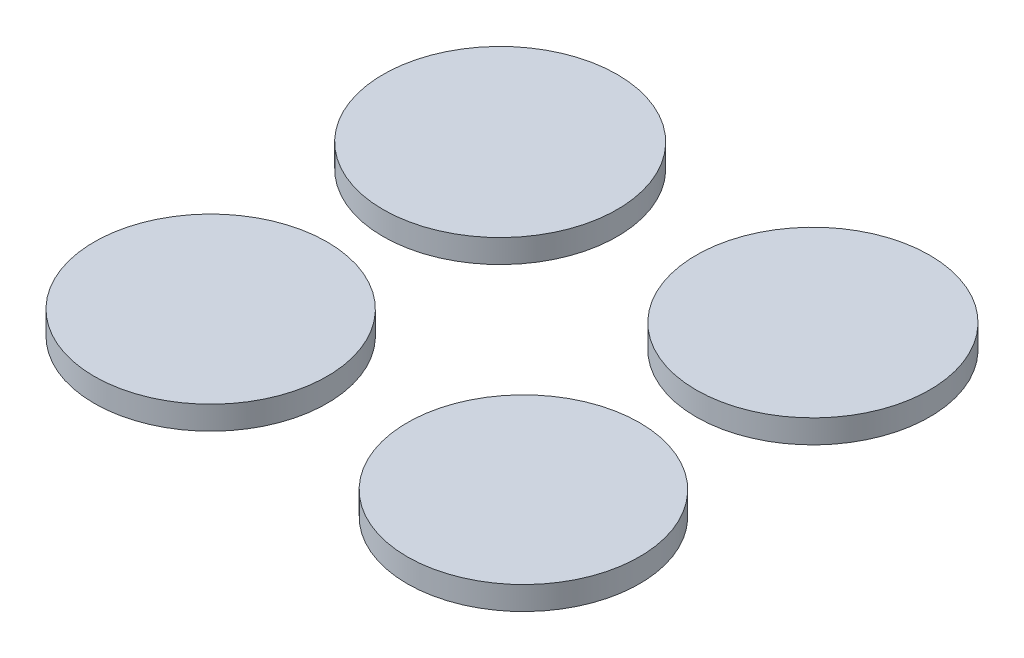
ISO-10303-21;
HEADER;
FILE_DESCRIPTION(('STEP AP214'),'2;1');
FILE_NAME('part.step','',(''),(''),'','','');
FILE_SCHEMA(('AUTOMOTIVE_DESIGN { 1 0 10303 214 1 1 1 1 }'));
ENDSEC;
DATA;
#1=APPLICATION_CONTEXT('core data for automotive mechanical design processes');
#2=APPLICATION_PROTOCOL_DEFINITION('international standard','automotive_design',2000,#1);
#3=PRODUCT_CONTEXT('',#1,'mechanical');
#4=PRODUCT('Part','Part','',(#3));
#5=PRODUCT_RELATED_PRODUCT_CATEGORY('part','',(#4));
#6=PRODUCT_DEFINITION_FORMATION('','',#4);
#7=PRODUCT_DEFINITION_CONTEXT('part definition',#1,'design');
#8=PRODUCT_DEFINITION('design','',#6,#7);
#9=PRODUCT_DEFINITION_SHAPE('','',#8);
#10=(LENGTH_UNIT() NAMED_UNIT(*) SI_UNIT(.MILLI.,.METRE.));
#11=(NAMED_UNIT(*) PLANE_ANGLE_UNIT() SI_UNIT($,.RADIAN.));
#12=(NAMED_UNIT(*) SI_UNIT($,.STERADIAN.) SOLID_ANGLE_UNIT());
#13=UNCERTAINTY_MEASURE_WITH_UNIT(LENGTH_MEASURE(1.E-05),#10,'distance_accuracy_value','');
#14=(GEOMETRIC_REPRESENTATION_CONTEXT(3) GLOBAL_UNCERTAINTY_ASSIGNED_CONTEXT((#13)) GLOBAL_UNIT_ASSIGNED_CONTEXT((#10,
#11,#12)) REPRESENTATION_CONTEXT('',''));
#15=CARTESIAN_POINT('',(0.,0.,0.));
#16=DIRECTION('',(0.,0.,1.));
#17=DIRECTION('',(1.,0.,0.));
#18=AXIS2_PLACEMENT_3D('',#15,#16,#17);
#19=CARTESIAN_POINT('',(0.,4.,49.4625298734181));
#20=DIRECTION('',(0.,-1.,0.));
#21=DIRECTION('',(0.,0.,-1.));
#22=AXIS2_PLACEMENT_3D('',#19,#20,#21);
#23=CYLINDRICAL_SURFACE('',#22,19.9);
#24=CARTESIAN_POINT('',(0.,4.,49.4625298734181));
#25=DIRECTION('',(0.,1.,0.));
#26=DIRECTION('',(0.,0.,1.));
#27=AXIS2_PLACEMENT_3D('',#24,#25,#26);
#28=CIRCLE('',#27,19.9);
#29=CARTESIAN_POINT('',(0.,4.,69.3625298734182));
#30=VERTEX_POINT('',#29);
#31=EDGE_CURVE('E56',#30,#30,#28,.T.);
#32=ORIENTED_EDGE('',*,*,#31,.F.);
#33=EDGE_LOOP('',(#32));
#34=FACE_BOUND('',#33,.T.);
#35=CARTESIAN_POINT('',(0.,0.,49.4625298734181));
#36=DIRECTION('',(0.,1.,0.));
#37=DIRECTION('',(0.,0.,1.));
#38=AXIS2_PLACEMENT_3D('',#35,#36,#37);
#39=CIRCLE('',#38,19.9);
#40=CARTESIAN_POINT('',(0.,0.,69.3625298734182));
#41=VERTEX_POINT('',#40);
#42=EDGE_CURVE('E11',#41,#41,#39,.T.);
#43=ORIENTED_EDGE('',*,*,#42,.T.);
#44=EDGE_LOOP('',(#43));
#45=FACE_BOUND('',#44,.T.);
#46=ADVANCED_FACE('F52',(#34,#45),#23,.T.);
#47=CARTESIAN_POINT('',(0.,4.,49.4625298734181));
#48=DIRECTION('',(0.,1.,0.));
#49=DIRECTION('',(0.,0.,1.));
#50=AXIS2_PLACEMENT_3D('',#47,#48,#49);
#51=PLANE('',#50);
#52=ORIENTED_EDGE('',*,*,#31,.T.);
#53=EDGE_LOOP('',(#52));
#54=FACE_BOUND('',#53,.T.);
#55=ADVANCED_FACE('F54',(#54),#51,.T.);
#56=CARTESIAN_POINT('',(0.,0.,49.4625298734181));
#57=DIRECTION('',(0.,1.,0.));
#58=DIRECTION('',(0.,0.,1.));
#59=AXIS2_PLACEMENT_3D('',#56,#57,#58);
#60=PLANE('',#59);
#61=ORIENTED_EDGE('',*,*,#42,.F.);
#62=EDGE_LOOP('',(#61));
#63=FACE_BOUND('',#62,.T.);
#64=ADVANCED_FACE('F71',(#63),#60,.F.);
#65=CLOSED_SHELL('',(#46,#55,#64));
#66=MANIFOLD_SOLID_BREP('B2',#65);
#67=CARTESIAN_POINT('',(53.4356591887973,4.,49.4625298734181));
#68=DIRECTION('',(0.,-1.,0.));
#69=DIRECTION('',(0.,0.,-1.));
#70=AXIS2_PLACEMENT_3D('',#67,#68,#69);
#71=CYLINDRICAL_SURFACE('',#70,19.85);
#72=CARTESIAN_POINT('',(53.4356591887973,4.,49.4625298734181));
#73=DIRECTION('',(0.,1.,0.));
#74=DIRECTION('',(0.,0.,1.));
#75=AXIS2_PLACEMENT_3D('',#72,#73,#74);
#76=CIRCLE('',#75,19.85);
#77=CARTESIAN_POINT('',(53.4356591887973,4.,69.3125298734182));
#78=VERTEX_POINT('',#77);
#79=EDGE_CURVE('E105',#78,#78,#76,.T.);
#80=ORIENTED_EDGE('',*,*,#79,.F.);
#81=EDGE_LOOP('',(#80));
#82=FACE_BOUND('',#81,.T.);
#83=CARTESIAN_POINT('',(53.4356591887973,0.,49.4625298734181));
#84=DIRECTION('',(0.,1.,0.));
#85=DIRECTION('',(0.,0.,1.));
#86=AXIS2_PLACEMENT_3D('',#83,#84,#85);
#87=CIRCLE('',#86,19.85);
#88=CARTESIAN_POINT('',(53.4356591887973,0.,69.3125298734182));
#89=VERTEX_POINT('',#88);
#90=EDGE_CURVE('E51',#89,#89,#87,.T.);
#91=ORIENTED_EDGE('',*,*,#90,.T.);
#92=EDGE_LOOP('',(#91));
#93=FACE_BOUND('',#92,.T.);
#94=ADVANCED_FACE('F101',(#82,#93),#71,.T.);
#95=CARTESIAN_POINT('',(53.4356591887973,4.,49.4625298734181));
#96=DIRECTION('',(0.,1.,0.));
#97=DIRECTION('',(0.,0.,1.));
#98=AXIS2_PLACEMENT_3D('',#95,#96,#97);
#99=PLANE('',#98);
#100=ORIENTED_EDGE('',*,*,#79,.T.);
#101=EDGE_LOOP('',(#100));
#102=FACE_BOUND('',#101,.T.);
#103=ADVANCED_FACE('F103',(#102),#99,.T.);
#104=CARTESIAN_POINT('',(53.4356591887973,0.,49.4625298734181));
#105=DIRECTION('',(0.,1.,0.));
#106=DIRECTION('',(0.,0.,1.));
#107=AXIS2_PLACEMENT_3D('',#104,#105,#106);
#108=PLANE('',#107);
#109=ORIENTED_EDGE('',*,*,#90,.F.);
#110=EDGE_LOOP('',(#109));
#111=FACE_BOUND('',#110,.T.);
#112=ADVANCED_FACE('F120',(#111),#108,.F.);
#113=CLOSED_SHELL('',(#94,#103,#112));
#114=MANIFOLD_SOLID_BREP('B6',#113);
#115=CARTESIAN_POINT('',(53.4356591887973,4.,0.));
#116=DIRECTION('',(0.,-1.,0.));
#117=DIRECTION('',(0.,0.,-1.));
#118=AXIS2_PLACEMENT_3D('',#115,#116,#117);
#119=CYLINDRICAL_SURFACE('',#118,19.95);
#120=CARTESIAN_POINT('',(53.4356591887973,4.,0.));
#121=DIRECTION('',(0.,1.,0.));
#122=DIRECTION('',(0.,0.,1.));
#123=AXIS2_PLACEMENT_3D('',#120,#121,#122);
#124=CIRCLE('',#123,19.95);
#125=CARTESIAN_POINT('',(53.4356591887973,4.,19.95));
#126=VERTEX_POINT('',#125);
#127=EDGE_CURVE('E153',#126,#126,#124,.T.);
#128=ORIENTED_EDGE('',*,*,#127,.F.);
#129=EDGE_LOOP('',(#128));
#130=FACE_BOUND('',#129,.T.);
#131=CARTESIAN_POINT('',(53.4356591887973,0.,0.));
#132=DIRECTION('',(0.,1.,0.));
#133=DIRECTION('',(0.,0.,1.));
#134=AXIS2_PLACEMENT_3D('',#131,#132,#133);
#135=CIRCLE('',#134,19.95);
#136=CARTESIAN_POINT('',(53.4356591887973,0.,19.95));
#137=VERTEX_POINT('',#136);
#138=EDGE_CURVE('E100',#137,#137,#135,.T.);
#139=ORIENTED_EDGE('',*,*,#138,.T.);
#140=EDGE_LOOP('',(#139));
#141=FACE_BOUND('',#140,.T.);
#142=ADVANCED_FACE('F149',(#130,#141),#119,.T.);
#143=CARTESIAN_POINT('',(53.4356591887973,4.,0.));
#144=DIRECTION('',(0.,1.,0.));
#145=DIRECTION('',(0.,0.,1.));
#146=AXIS2_PLACEMENT_3D('',#143,#144,#145);
#147=PLANE('',#146);
#148=ORIENTED_EDGE('',*,*,#127,.T.);
#149=EDGE_LOOP('',(#148));
#150=FACE_BOUND('',#149,.T.);
#151=ADVANCED_FACE('F151',(#150),#147,.T.);
#152=CARTESIAN_POINT('',(53.4356591887973,0.,0.));
#153=DIRECTION('',(0.,1.,0.));
#154=DIRECTION('',(0.,0.,1.));
#155=AXIS2_PLACEMENT_3D('',#152,#153,#154);
#156=PLANE('',#155);
#157=ORIENTED_EDGE('',*,*,#138,.F.);
#158=EDGE_LOOP('',(#157));
#159=FACE_BOUND('',#158,.T.);
#160=ADVANCED_FACE('F168',(#159),#156,.F.);
#161=CLOSED_SHELL('',(#142,#151,#160));
#162=MANIFOLD_SOLID_BREP('B46',#161);
#163=CARTESIAN_POINT('',(0.,4.,0.));
#164=DIRECTION('',(0.,-1.,0.));
#165=DIRECTION('',(0.,0.,-1.));
#166=AXIS2_PLACEMENT_3D('',#163,#164,#165);
#167=CYLINDRICAL_SURFACE('',#166,20.);
#168=CARTESIAN_POINT('',(0.,4.,0.));
#169=DIRECTION('',(0.,1.,0.));
#170=DIRECTION('',(0.,0.,1.));
#171=AXIS2_PLACEMENT_3D('',#168,#169,#170);
#172=CIRCLE('',#171,20.);
#173=CARTESIAN_POINT('',(0.,4.,20.));
#174=VERTEX_POINT('',#173);
#175=EDGE_CURVE('E148',#174,#174,#172,.T.);
#176=ORIENTED_EDGE('',*,*,#175,.F.);
#177=EDGE_LOOP('',(#176));
#178=FACE_BOUND('',#177,.T.);
#179=CARTESIAN_POINT('',(0.,0.,0.));
#180=DIRECTION('',(0.,1.,0.));
#181=DIRECTION('',(0.,0.,1.));
#182=AXIS2_PLACEMENT_3D('',#179,#180,#181);
#183=CIRCLE('',#182,20.);
#184=CARTESIAN_POINT('',(0.,0.,20.));
#185=VERTEX_POINT('',#184);
#186=EDGE_CURVE('E193',#185,#185,#183,.T.);
#187=ORIENTED_EDGE('',*,*,#186,.T.);
#188=EDGE_LOOP('',(#187));
#189=FACE_BOUND('',#188,.T.);
#190=ADVANCED_FACE('F190',(#178,#189),#167,.T.);
#191=CARTESIAN_POINT('',(0.,4.,0.));
#192=DIRECTION('',(0.,1.,0.));
#193=DIRECTION('',(0.,0.,1.));
#194=AXIS2_PLACEMENT_3D('',#191,#192,#193);
#195=PLANE('',#194);
#196=ORIENTED_EDGE('',*,*,#175,.T.);
#197=EDGE_LOOP('',(#196));
#198=FACE_BOUND('',#197,.T.);
#199=ADVANCED_FACE('F207',(#198),#195,.T.);
#200=CARTESIAN_POINT('',(0.,0.,0.));
#201=DIRECTION('',(0.,1.,0.));
#202=DIRECTION('',(0.,0.,1.));
#203=AXIS2_PLACEMENT_3D('',#200,#201,#202);
#204=PLANE('',#203);
#205=ORIENTED_EDGE('',*,*,#186,.F.);
#206=EDGE_LOOP('',(#205));
#207=FACE_BOUND('',#206,.T.);
#208=ADVANCED_FACE('F205',(#207),#204,.F.);
#209=CLOSED_SHELL('',(#190,#199,#208));
#210=MANIFOLD_SOLID_BREP('B95',#209);
#211=ADVANCED_BREP_SHAPE_REPRESENTATION('',(#18,#66,#114,#162,#210),#14);
#212=SHAPE_DEFINITION_REPRESENTATION(#9,#211);
ENDSEC;
END-ISO-10303-21;
